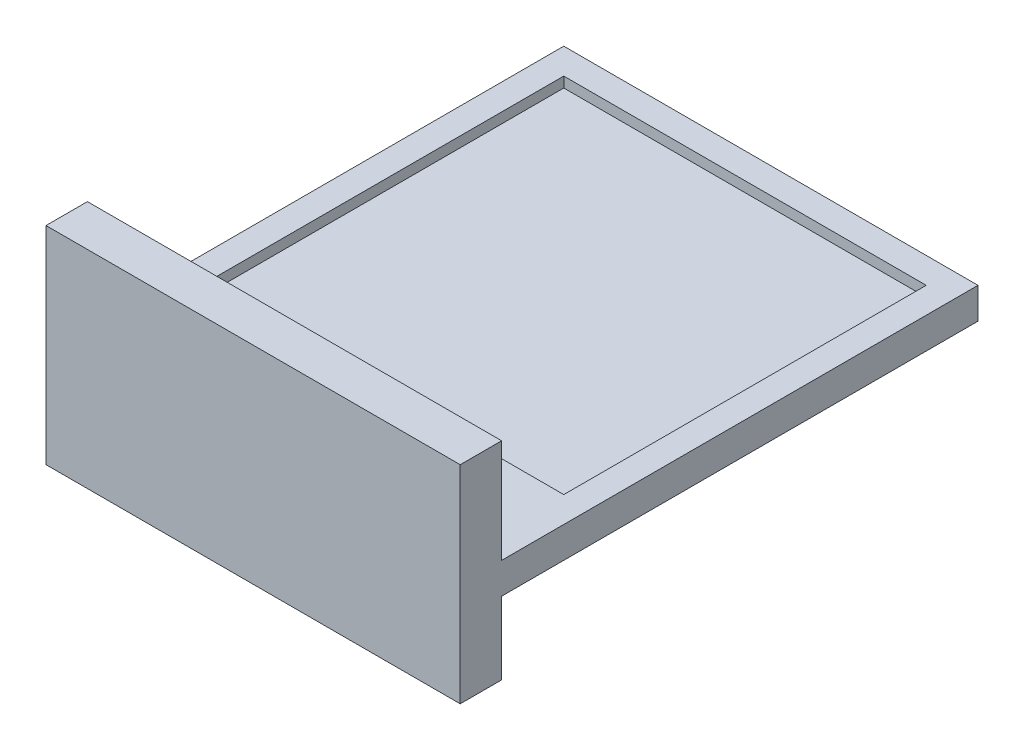
ISO-10303-21;
HEADER;
FILE_DESCRIPTION(('STEP AP214'),'2;1');
FILE_NAME('part.step','',(''),(''),'','','');
FILE_SCHEMA(('AUTOMOTIVE_DESIGN { 1 0 10303 214 1 1 1 1 }'));
ENDSEC;
DATA;
#1=APPLICATION_CONTEXT('core data for automotive mechanical design processes');
#2=APPLICATION_PROTOCOL_DEFINITION('international standard','automotive_design',2000,#1);
#3=PRODUCT_CONTEXT('',#1,'mechanical');
#4=PRODUCT('Part','Part','',(#3));
#5=PRODUCT_RELATED_PRODUCT_CATEGORY('part','',(#4));
#6=PRODUCT_DEFINITION_FORMATION('','',#4);
#7=PRODUCT_DEFINITION_CONTEXT('part definition',#1,'design');
#8=PRODUCT_DEFINITION('design','',#6,#7);
#9=PRODUCT_DEFINITION_SHAPE('','',#8);
#10=(LENGTH_UNIT() NAMED_UNIT(*) SI_UNIT(.MILLI.,.METRE.));
#11=(NAMED_UNIT(*) PLANE_ANGLE_UNIT() SI_UNIT($,.RADIAN.));
#12=(NAMED_UNIT(*) SI_UNIT($,.STERADIAN.) SOLID_ANGLE_UNIT());
#13=UNCERTAINTY_MEASURE_WITH_UNIT(LENGTH_MEASURE(1.E-05),#10,'distance_accuracy_value','');
#14=(GEOMETRIC_REPRESENTATION_CONTEXT(3) GLOBAL_UNCERTAINTY_ASSIGNED_CONTEXT((#13)) GLOBAL_UNIT_ASSIGNED_CONTEXT((#10,
#11,#12)) REPRESENTATION_CONTEXT('',''));
#15=CARTESIAN_POINT('',(0.,0.,0.));
#16=DIRECTION('',(0.,0.,1.));
#17=DIRECTION('',(1.,0.,0.));
#18=AXIS2_PLACEMENT_3D('',#15,#16,#17);
#19=CARTESIAN_POINT('',(-3.5,0.2,-4.5));
#20=DIRECTION('',(-1.,0.,0.));
#21=DIRECTION('',(0.,0.,1.));
#22=AXIS2_PLACEMENT_3D('',#19,#20,#21);
#23=PLANE('',#22);
#24=DIRECTION('',(0.,0.,1.));
#25=VECTOR('',#24,1.);
#26=CARTESIAN_POINT('',(-3.5,0.4,-4.5));
#27=LINE('',#26,#25);
#28=CARTESIAN_POINT('',(-3.5,0.4,-4.5));
#29=VERTEX_POINT('',#28);
#30=CARTESIAN_POINT('',(-3.5,0.4,2.5));
#31=VERTEX_POINT('',#30);
#32=EDGE_CURVE('E224',#29,#31,#27,.T.);
#33=ORIENTED_EDGE('',*,*,#32,.F.);
#34=DIRECTION('',(0.,1.,0.));
#35=VECTOR('',#34,1.);
#36=CARTESIAN_POINT('',(-3.5,0.2,-4.5));
#37=LINE('',#36,#35);
#38=CARTESIAN_POINT('',(-3.5,0.6,-4.5));
#39=VERTEX_POINT('',#38);
#40=EDGE_CURVE('E239',#29,#39,#37,.T.);
#41=ORIENTED_EDGE('',*,*,#40,.T.);
#42=DIRECTION('',(0.,0.,1.));
#43=VECTOR('',#42,1.);
#44=CARTESIAN_POINT('',(-3.5,0.6,-4.5));
#45=LINE('',#44,#43);
#46=CARTESIAN_POINT('',(-3.5,0.6,2.5));
#47=VERTEX_POINT('',#46);
#48=EDGE_CURVE('E226',#39,#47,#45,.T.);
#49=ORIENTED_EDGE('',*,*,#48,.T.);
#50=DIRECTION('',(0.,1.,0.));
#51=VECTOR('',#50,1.);
#52=CARTESIAN_POINT('',(-3.5,0.2,2.5));
#53=LINE('',#52,#51);
#54=EDGE_CURVE('E238',#31,#47,#53,.T.);
#55=ORIENTED_EDGE('',*,*,#54,.F.);
#56=EDGE_LOOP('',(#33,#41,#49,#55));
#57=FACE_BOUND('',#56,.T.);
#58=ADVANCED_FACE('F33',(#57),#23,.F.);
#59=CARTESIAN_POINT('',(-3.5,0.2,-4.5));
#60=DIRECTION('',(0.,0.,-1.));
#61=DIRECTION('',(-1.,0.,0.));
#62=AXIS2_PLACEMENT_3D('',#59,#60,#61);
#63=PLANE('',#62);
#64=DIRECTION('',(-1.,0.,0.));
#65=VECTOR('',#64,1.);
#66=CARTESIAN_POINT('',(-3.5,0.4,-4.5));
#67=LINE('',#66,#65);
#68=CARTESIAN_POINT('',(3.5,0.4,-4.5));
#69=VERTEX_POINT('',#68);
#70=EDGE_CURVE('E222',#69,#29,#67,.T.);
#71=ORIENTED_EDGE('',*,*,#70,.F.);
#72=DIRECTION('',(0.,1.,0.));
#73=VECTOR('',#72,1.);
#74=CARTESIAN_POINT('',(3.5,0.2,-4.5));
#75=LINE('',#74,#73);
#76=CARTESIAN_POINT('',(3.5,0.6,-4.5));
#77=VERTEX_POINT('',#76);
#78=EDGE_CURVE('E242',#69,#77,#75,.T.);
#79=ORIENTED_EDGE('',*,*,#78,.T.);
#80=DIRECTION('',(-1.,0.,0.));
#81=VECTOR('',#80,1.);
#82=CARTESIAN_POINT('',(-3.5,0.6,-4.5));
#83=LINE('',#82,#81);
#84=EDGE_CURVE('E235',#77,#39,#83,.T.);
#85=ORIENTED_EDGE('',*,*,#84,.T.);
#86=ORIENTED_EDGE('',*,*,#40,.F.);
#87=EDGE_LOOP('',(#71,#79,#85,#86));
#88=FACE_BOUND('',#87,.T.);
#89=ADVANCED_FACE('F284',(#88),#63,.F.);
#90=CARTESIAN_POINT('',(3.5,0.2,-4.5));
#91=DIRECTION('',(1.,0.,0.));
#92=DIRECTION('',(0.,0.,-1.));
#93=AXIS2_PLACEMENT_3D('',#90,#91,#92);
#94=PLANE('',#93);
#95=DIRECTION('',(0.,0.,-1.));
#96=VECTOR('',#95,1.);
#97=CARTESIAN_POINT('',(3.5,0.4,-4.5));
#98=LINE('',#97,#96);
#99=CARTESIAN_POINT('',(3.5,0.4,2.5));
#100=VERTEX_POINT('',#99);
#101=EDGE_CURVE('E214',#100,#69,#98,.T.);
#102=ORIENTED_EDGE('',*,*,#101,.F.);
#103=DIRECTION('',(0.,1.,0.));
#104=VECTOR('',#103,1.);
#105=CARTESIAN_POINT('',(3.5,0.2,2.5));
#106=LINE('',#105,#104);
#107=CARTESIAN_POINT('',(3.5,0.6,2.5));
#108=VERTEX_POINT('',#107);
#109=EDGE_CURVE('E244',#100,#108,#106,.T.);
#110=ORIENTED_EDGE('',*,*,#109,.T.);
#111=DIRECTION('',(0.,0.,-1.));
#112=VECTOR('',#111,1.);
#113=CARTESIAN_POINT('',(3.5,0.6,-4.5));
#114=LINE('',#113,#112);
#115=EDGE_CURVE('E232',#108,#77,#114,.T.);
#116=ORIENTED_EDGE('',*,*,#115,.T.);
#117=ORIENTED_EDGE('',*,*,#78,.F.);
#118=EDGE_LOOP('',(#102,#110,#116,#117));
#119=FACE_BOUND('',#118,.T.);
#120=ADVANCED_FACE('F274',(#119),#94,.F.);
#121=CARTESIAN_POINT('',(-3.5,0.2,2.5));
#122=DIRECTION('',(0.,0.,1.));
#123=DIRECTION('',(1.,0.,0.));
#124=AXIS2_PLACEMENT_3D('',#121,#122,#123);
#125=PLANE('',#124);
#126=DIRECTION('',(1.,0.,0.));
#127=VECTOR('',#126,1.);
#128=CARTESIAN_POINT('',(-3.5,0.4,2.5));
#129=LINE('',#128,#127);
#130=EDGE_CURVE('E41',#31,#100,#129,.T.);
#131=ORIENTED_EDGE('',*,*,#130,.F.);
#132=ORIENTED_EDGE('',*,*,#54,.T.);
#133=DIRECTION('',(1.,0.,0.));
#134=VECTOR('',#133,1.);
#135=CARTESIAN_POINT('',(-3.5,0.6,2.5));
#136=LINE('',#135,#134);
#137=EDGE_CURVE('E229',#47,#108,#136,.T.);
#138=ORIENTED_EDGE('',*,*,#137,.T.);
#139=ORIENTED_EDGE('',*,*,#109,.F.);
#140=EDGE_LOOP('',(#131,#132,#138,#139));
#141=FACE_BOUND('',#140,.T.);
#142=ADVANCED_FACE('F275',(#141),#125,.F.);
#143=CARTESIAN_POINT('',(-4.,0.6,5.));
#144=DIRECTION('',(1.,0.,0.));
#145=DIRECTION('',(0.,0.,-1.));
#146=AXIS2_PLACEMENT_3D('',#143,#144,#145);
#147=PLANE('',#146);
#148=DIRECTION('',(0.,0.,1.));
#149=VECTOR('',#148,1.);
#150=CARTESIAN_POINT('',(-4.,0.,5.));
#151=LINE('',#150,#149);
#152=CARTESIAN_POINT('',(-4.,0.,-5.));
#153=VERTEX_POINT('',#152);
#154=CARTESIAN_POINT('',(-4.,0.,4.2));
#155=VERTEX_POINT('',#154);
#156=EDGE_CURVE('E241',#153,#155,#151,.T.);
#157=ORIENTED_EDGE('',*,*,#156,.T.);
#158=DIRECTION('',(0.,1.,0.));
#159=VECTOR('',#158,1.);
#160=CARTESIAN_POINT('',(-4.,-1.4,4.2));
#161=LINE('',#160,#159);
#162=CARTESIAN_POINT('',(-4.,-1.4,4.2));
#163=VERTEX_POINT('',#162);
#164=EDGE_CURVE('E183',#163,#155,#161,.T.);
#165=ORIENTED_EDGE('',*,*,#164,.F.);
#166=DIRECTION('',(0.,0.,1.));
#167=VECTOR('',#166,1.);
#168=CARTESIAN_POINT('',(-4.,-1.4,5.));
#169=LINE('',#168,#167);
#170=CARTESIAN_POINT('',(-4.,-1.4,5.));
#171=VERTEX_POINT('',#170);
#172=EDGE_CURVE('E151',#163,#171,#169,.T.);
#173=ORIENTED_EDGE('',*,*,#172,.T.);
#174=DIRECTION('',(0.,-1.,0.));
#175=VECTOR('',#174,1.);
#176=CARTESIAN_POINT('',(-4.,0.6,5.));
#177=LINE('',#176,#175);
#178=CARTESIAN_POINT('',(-4.,2.6,5.));
#179=VERTEX_POINT('',#178);
#180=EDGE_CURVE('E144',#179,#171,#177,.T.);
#181=ORIENTED_EDGE('',*,*,#180,.F.);
#182=DIRECTION('',(0.,0.,1.));
#183=VECTOR('',#182,1.);
#184=CARTESIAN_POINT('',(-4.,2.6,5.));
#185=LINE('',#184,#183);
#186=CARTESIAN_POINT('',(-4.,2.6,4.2));
#187=VERTEX_POINT('',#186);
#188=EDGE_CURVE('E149',#187,#179,#185,.T.);
#189=ORIENTED_EDGE('',*,*,#188,.F.);
#190=CARTESIAN_POINT('',(-4.,0.6,4.2));
#191=VERTEX_POINT('',#190);
#192=EDGE_CURVE('E185',#191,#187,#161,.T.);
#193=ORIENTED_EDGE('',*,*,#192,.F.);
#194=DIRECTION('',(0.,0.,1.));
#195=VECTOR('',#194,1.);
#196=CARTESIAN_POINT('',(-4.,0.6,5.));
#197=LINE('',#196,#195);
#198=CARTESIAN_POINT('',(-4.,0.6,-5.));
#199=VERTEX_POINT('',#198);
#200=EDGE_CURVE('E53',#199,#191,#197,.T.);
#201=ORIENTED_EDGE('',*,*,#200,.F.);
#202=DIRECTION('',(0.,-1.,0.));
#203=VECTOR('',#202,1.);
#204=CARTESIAN_POINT('',(-4.,0.6,-5.));
#205=LINE('',#204,#203);
#206=EDGE_CURVE('E253',#199,#153,#205,.T.);
#207=ORIENTED_EDGE('',*,*,#206,.T.);
#208=EDGE_LOOP('',(#157,#165,#173,#181,#189,#193,#201,#207));
#209=FACE_BOUND('',#208,.T.);
#210=ADVANCED_FACE('F35',(#209),#147,.F.);
#211=CARTESIAN_POINT('',(4.,0.6,5.));
#212=DIRECTION('',(0.,0.,-1.));
#213=DIRECTION('',(-1.,0.,0.));
#214=AXIS2_PLACEMENT_3D('',#211,#212,#213);
#215=PLANE('',#214);
#216=ORIENTED_EDGE('',*,*,#180,.T.);
#217=DIRECTION('',(1.,0.,0.));
#218=VECTOR('',#217,1.);
#219=CARTESIAN_POINT('',(-4.,-1.4,5.));
#220=LINE('',#219,#218);
#221=CARTESIAN_POINT('',(4.,-1.4,5.));
#222=VERTEX_POINT('',#221);
#223=EDGE_CURVE('E174',#171,#222,#220,.T.);
#224=ORIENTED_EDGE('',*,*,#223,.T.);
#225=DIRECTION('',(0.,-1.,0.));
#226=VECTOR('',#225,1.);
#227=CARTESIAN_POINT('',(4.,0.6,5.));
#228=LINE('',#227,#226);
#229=CARTESIAN_POINT('',(4.,2.6,5.));
#230=VERTEX_POINT('',#229);
#231=EDGE_CURVE('E155',#230,#222,#228,.T.);
#232=ORIENTED_EDGE('',*,*,#231,.F.);
#233=DIRECTION('',(1.,0.,0.));
#234=VECTOR('',#233,1.);
#235=CARTESIAN_POINT('',(-4.,2.6,5.));
#236=LINE('',#235,#234);
#237=EDGE_CURVE('E158',#179,#230,#236,.T.);
#238=ORIENTED_EDGE('',*,*,#237,.F.);
#239=EDGE_LOOP('',(#216,#224,#232,#238));
#240=FACE_BOUND('',#239,.T.);
#241=ADVANCED_FACE('F159',(#240),#215,.F.);
#242=CARTESIAN_POINT('',(4.,0.6,5.));
#243=DIRECTION('',(-1.,0.,0.));
#244=DIRECTION('',(0.,0.,1.));
#245=AXIS2_PLACEMENT_3D('',#242,#243,#244);
#246=PLANE('',#245);
#247=DIRECTION('',(0.,0.,-1.));
#248=VECTOR('',#247,1.);
#249=CARTESIAN_POINT('',(4.,0.6,5.));
#250=LINE('',#249,#248);
#251=CARTESIAN_POINT('',(4.,0.6,4.2));
#252=VERTEX_POINT('',#251);
#253=CARTESIAN_POINT('',(4.,0.6,-5.));
#254=VERTEX_POINT('',#253);
#255=EDGE_CURVE('E248',#252,#254,#250,.T.);
#256=ORIENTED_EDGE('',*,*,#255,.F.);
#257=DIRECTION('',(0.,1.,0.));
#258=VECTOR('',#257,1.);
#259=CARTESIAN_POINT('',(4.,-1.4,4.2));
#260=LINE('',#259,#258);
#261=CARTESIAN_POINT('',(4.,2.6,4.2));
#262=VERTEX_POINT('',#261);
#263=EDGE_CURVE('E182',#252,#262,#260,.T.);
#264=ORIENTED_EDGE('',*,*,#263,.T.);
#265=DIRECTION('',(0.,0.,-1.));
#266=VECTOR('',#265,1.);
#267=CARTESIAN_POINT('',(4.,2.6,5.));
#268=LINE('',#267,#266);
#269=EDGE_CURVE('E163',#230,#262,#268,.T.);
#270=ORIENTED_EDGE('',*,*,#269,.F.);
#271=ORIENTED_EDGE('',*,*,#231,.T.);
#272=DIRECTION('',(0.,0.,-1.));
#273=VECTOR('',#272,1.);
#274=CARTESIAN_POINT('',(4.,-1.4,5.));
#275=LINE('',#274,#273);
#276=CARTESIAN_POINT('',(4.,-1.4,4.2));
#277=VERTEX_POINT('',#276);
#278=EDGE_CURVE('E176',#222,#277,#275,.T.);
#279=ORIENTED_EDGE('',*,*,#278,.T.);
#280=CARTESIAN_POINT('',(4.,0.,4.2));
#281=VERTEX_POINT('',#280);
#282=EDGE_CURVE('E186',#277,#281,#260,.T.);
#283=ORIENTED_EDGE('',*,*,#282,.T.);
#284=DIRECTION('',(0.,0.,-1.));
#285=VECTOR('',#284,1.);
#286=CARTESIAN_POINT('',(4.,0.,5.));
#287=LINE('',#286,#285);
#288=CARTESIAN_POINT('',(4.,0.,-5.));
#289=VERTEX_POINT('',#288);
#290=EDGE_CURVE('E255',#281,#289,#287,.T.);
#291=ORIENTED_EDGE('',*,*,#290,.T.);
#292=DIRECTION('',(0.,-1.,0.));
#293=VECTOR('',#292,1.);
#294=CARTESIAN_POINT('',(4.,0.6,-5.));
#295=LINE('',#294,#293);
#296=EDGE_CURVE('E260',#254,#289,#295,.T.);
#297=ORIENTED_EDGE('',*,*,#296,.F.);
#298=EDGE_LOOP('',(#256,#264,#270,#271,#279,#283,#291,#297));
#299=FACE_BOUND('',#298,.T.);
#300=ADVANCED_FACE('F304',(#299),#246,.F.);
#301=CARTESIAN_POINT('',(4.,0.6,-5.));
#302=DIRECTION('',(0.,0.,1.));
#303=DIRECTION('',(1.,0.,0.));
#304=AXIS2_PLACEMENT_3D('',#301,#302,#303);
#305=PLANE('',#304);
#306=DIRECTION('',(-1.,0.,0.));
#307=VECTOR('',#306,1.);
#308=CARTESIAN_POINT('',(3.7,0.2,-5.));
#309=LINE('',#308,#307);
#310=CARTESIAN_POINT('',(3.7,0.2,-5.));
#311=VERTEX_POINT('',#310);
#312=CARTESIAN_POINT('',(-3.7,0.2,-5.));
#313=VERTEX_POINT('',#312);
#314=EDGE_CURVE('E204',#311,#313,#309,.T.);
#315=ORIENTED_EDGE('',*,*,#314,.F.);
#316=DIRECTION('',(0.,-1.,0.));
#317=VECTOR('',#316,1.);
#318=CARTESIAN_POINT('',(3.7,0.4,-5.));
#319=LINE('',#318,#317);
#320=CARTESIAN_POINT('',(3.7,0.4,-5.));
#321=VERTEX_POINT('',#320);
#322=EDGE_CURVE('E190',#321,#311,#319,.T.);
#323=ORIENTED_EDGE('',*,*,#322,.F.);
#324=DIRECTION('',(-1.,0.,0.));
#325=VECTOR('',#324,1.);
#326=CARTESIAN_POINT('',(3.7,0.4,-5.));
#327=LINE('',#326,#325);
#328=CARTESIAN_POINT('',(-3.7,0.4,-5.));
#329=VERTEX_POINT('',#328);
#330=EDGE_CURVE('E195',#321,#329,#327,.T.);
#331=ORIENTED_EDGE('',*,*,#330,.T.);
#332=DIRECTION('',(0.,-1.,0.));
#333=VECTOR('',#332,1.);
#334=CARTESIAN_POINT('',(-3.7,0.4,-5.));
#335=LINE('',#334,#333);
#336=EDGE_CURVE('E207',#329,#313,#335,.T.);
#337=ORIENTED_EDGE('',*,*,#336,.T.);
#338=EDGE_LOOP('',(#315,#323,#331,#337));
#339=FACE_BOUND('',#338,.T.);
#340=DIRECTION('',(-1.,0.,0.));
#341=VECTOR('',#340,1.);
#342=CARTESIAN_POINT('',(4.,0.,-5.));
#343=LINE('',#342,#341);
#344=EDGE_CURVE('E249',#289,#153,#343,.T.);
#345=ORIENTED_EDGE('',*,*,#344,.T.);
#346=ORIENTED_EDGE('',*,*,#206,.F.);
#347=DIRECTION('',(-1.,0.,0.));
#348=VECTOR('',#347,1.);
#349=CARTESIAN_POINT('',(4.,0.6,-5.));
#350=LINE('',#349,#348);
#351=EDGE_CURVE('E251',#254,#199,#350,.T.);
#352=ORIENTED_EDGE('',*,*,#351,.F.);
#353=ORIENTED_EDGE('',*,*,#296,.T.);
#354=EDGE_LOOP('',(#345,#346,#352,#353));
#355=FACE_BOUND('',#354,.T.);
#356=ADVANCED_FACE('F298',(#339,#355),#305,.F.);
#357=CARTESIAN_POINT('',(0.,0.6,0.));
#358=DIRECTION('',(0.,1.,0.));
#359=DIRECTION('',(0.,0.,1.));
#360=AXIS2_PLACEMENT_3D('',#357,#358,#359);
#361=PLANE('',#360);
#362=DIRECTION('',(-1.,0.,0.));
#363=VECTOR('',#362,1.);
#364=CARTESIAN_POINT('',(0.,0.6,4.2));
#365=LINE('',#364,#363);
#366=EDGE_CURVE('E48',#252,#191,#365,.T.);
#367=ORIENTED_EDGE('',*,*,#366,.F.);
#368=ORIENTED_EDGE('',*,*,#255,.T.);
#369=ORIENTED_EDGE('',*,*,#351,.T.);
#370=ORIENTED_EDGE('',*,*,#200,.T.);
#371=EDGE_LOOP('',(#367,#368,#369,#370));
#372=FACE_BOUND('',#371,.T.);
#373=ORIENTED_EDGE('',*,*,#48,.F.);
#374=ORIENTED_EDGE('',*,*,#84,.F.);
#375=ORIENTED_EDGE('',*,*,#115,.F.);
#376=ORIENTED_EDGE('',*,*,#137,.F.);
#377=EDGE_LOOP('',(#373,#374,#375,#376));
#378=FACE_BOUND('',#377,.T.);
#379=ADVANCED_FACE('F281',(#372,#378),#361,.T.);
#380=CARTESIAN_POINT('',(0.,0.,0.));
#381=DIRECTION('',(0.,1.,0.));
#382=DIRECTION('',(0.,0.,1.));
#383=AXIS2_PLACEMENT_3D('',#380,#381,#382);
#384=PLANE('',#383);
#385=ORIENTED_EDGE('',*,*,#290,.F.);
#386=DIRECTION('',(-1.,0.,0.));
#387=VECTOR('',#386,1.);
#388=CARTESIAN_POINT('',(0.,0.,4.2));
#389=LINE('',#388,#387);
#390=EDGE_CURVE('E11',#281,#155,#389,.T.);
#391=ORIENTED_EDGE('',*,*,#390,.T.);
#392=ORIENTED_EDGE('',*,*,#156,.F.);
#393=ORIENTED_EDGE('',*,*,#344,.F.);
#394=EDGE_LOOP('',(#385,#391,#392,#393));
#395=FACE_BOUND('',#394,.T.);
#396=ADVANCED_FACE('F297',(#395),#384,.F.);
#397=CARTESIAN_POINT('',(3.7,0.4,3.));
#398=DIRECTION('',(0.,-1.,0.));
#399=DIRECTION('',(0.,0.,-1.));
#400=AXIS2_PLACEMENT_3D('',#397,#398,#399);
#401=PLANE('',#400);
#402=ORIENTED_EDGE('',*,*,#330,.F.);
#403=DIRECTION('',(0.,0.,-1.));
#404=VECTOR('',#403,1.);
#405=CARTESIAN_POINT('',(3.7,0.4,3.));
#406=LINE('',#405,#404);
#407=CARTESIAN_POINT('',(3.7,0.4,3.));
#408=VERTEX_POINT('',#407);
#409=EDGE_CURVE('E212',#408,#321,#406,.T.);
#410=ORIENTED_EDGE('',*,*,#409,.F.);
#411=DIRECTION('',(-1.,0.,0.));
#412=VECTOR('',#411,1.);
#413=CARTESIAN_POINT('',(3.7,0.4,3.));
#414=LINE('',#413,#412);
#415=CARTESIAN_POINT('',(-3.7,0.4,3.));
#416=VERTEX_POINT('',#415);
#417=EDGE_CURVE('E200',#408,#416,#414,.T.);
#418=ORIENTED_EDGE('',*,*,#417,.T.);
#419=DIRECTION('',(0.,0.,-1.));
#420=VECTOR('',#419,1.);
#421=CARTESIAN_POINT('',(-3.7,0.4,3.));
#422=LINE('',#421,#420);
#423=EDGE_CURVE('E215',#416,#329,#422,.T.);
#424=ORIENTED_EDGE('',*,*,#423,.T.);
#425=EDGE_LOOP('',(#402,#410,#418,#424));
#426=FACE_BOUND('',#425,.T.);
#427=ORIENTED_EDGE('',*,*,#32,.T.);
#428=ORIENTED_EDGE('',*,*,#130,.T.);
#429=ORIENTED_EDGE('',*,*,#101,.T.);
#430=ORIENTED_EDGE('',*,*,#70,.T.);
#431=EDGE_LOOP('',(#427,#428,#429,#430));
#432=FACE_BOUND('',#431,.T.);
#433=ADVANCED_FACE('F266',(#426,#432),#401,.T.);
#434=CARTESIAN_POINT('',(3.7,0.4,3.));
#435=DIRECTION('',(1.,0.,0.));
#436=DIRECTION('',(0.,0.,-1.));
#437=AXIS2_PLACEMENT_3D('',#434,#435,#436);
#438=PLANE('',#437);
#439=ORIENTED_EDGE('',*,*,#322,.T.);
#440=DIRECTION('',(0.,0.,-1.));
#441=VECTOR('',#440,1.);
#442=CARTESIAN_POINT('',(3.7,0.2,3.));
#443=LINE('',#442,#441);
#444=CARTESIAN_POINT('',(3.7,0.2,3.));
#445=VERTEX_POINT('',#444);
#446=EDGE_CURVE('E202',#445,#311,#443,.T.);
#447=ORIENTED_EDGE('',*,*,#446,.F.);
#448=DIRECTION('',(0.,-1.,0.));
#449=VECTOR('',#448,1.);
#450=CARTESIAN_POINT('',(3.7,0.4,3.));
#451=LINE('',#450,#449);
#452=EDGE_CURVE('E191',#408,#445,#451,.T.);
#453=ORIENTED_EDGE('',*,*,#452,.F.);
#454=ORIENTED_EDGE('',*,*,#409,.T.);
#455=EDGE_LOOP('',(#439,#447,#453,#454));
#456=FACE_BOUND('',#455,.T.);
#457=ADVANCED_FACE('F327',(#456),#438,.F.);
#458=CARTESIAN_POINT('',(-3.7,0.4,3.));
#459=DIRECTION('',(1.,0.,0.));
#460=DIRECTION('',(0.,1.,0.));
#461=AXIS2_PLACEMENT_3D('',#458,#459,#460);
#462=PLANE('',#461);
#463=ORIENTED_EDGE('',*,*,#336,.F.);
#464=ORIENTED_EDGE('',*,*,#423,.F.);
#465=DIRECTION('',(0.,-1.,0.));
#466=VECTOR('',#465,1.);
#467=CARTESIAN_POINT('',(-3.7,0.4,3.));
#468=LINE('',#467,#466);
#469=CARTESIAN_POINT('',(-3.7,0.2,3.));
#470=VERTEX_POINT('',#469);
#471=EDGE_CURVE('E198',#416,#470,#468,.T.);
#472=ORIENTED_EDGE('',*,*,#471,.T.);
#473=DIRECTION('',(0.,0.,-1.));
#474=VECTOR('',#473,1.);
#475=CARTESIAN_POINT('',(-3.7,0.2,3.));
#476=LINE('',#475,#474);
#477=EDGE_CURVE('E217',#470,#313,#476,.T.);
#478=ORIENTED_EDGE('',*,*,#477,.T.);
#479=EDGE_LOOP('',(#463,#464,#472,#478));
#480=FACE_BOUND('',#479,.T.);
#481=ADVANCED_FACE('F330',(#480),#462,.T.);
#482=CARTESIAN_POINT('',(0.,0.,3.));
#483=DIRECTION('',(0.,0.,-1.));
#484=DIRECTION('',(-1.,0.,0.));
#485=AXIS2_PLACEMENT_3D('',#482,#483,#484);
#486=PLANE('',#485);
#487=ORIENTED_EDGE('',*,*,#452,.T.);
#488=DIRECTION('',(-1.,0.,0.));
#489=VECTOR('',#488,1.);
#490=CARTESIAN_POINT('',(3.7,0.2,3.));
#491=LINE('',#490,#489);
#492=EDGE_CURVE('E194',#445,#470,#491,.T.);
#493=ORIENTED_EDGE('',*,*,#492,.T.);
#494=ORIENTED_EDGE('',*,*,#471,.F.);
#495=ORIENTED_EDGE('',*,*,#417,.F.);
#496=EDGE_LOOP('',(#487,#493,#494,#495));
#497=FACE_BOUND('',#496,.T.);
#498=ADVANCED_FACE('F325',(#497),#486,.T.);
#499=CARTESIAN_POINT('',(0.,0.2,0.));
#500=DIRECTION('',(0.,1.,0.));
#501=DIRECTION('',(0.,0.,1.));
#502=AXIS2_PLACEMENT_3D('',#499,#500,#501);
#503=PLANE('',#502);
#504=ORIENTED_EDGE('',*,*,#314,.T.);
#505=ORIENTED_EDGE('',*,*,#477,.F.);
#506=ORIENTED_EDGE('',*,*,#492,.F.);
#507=ORIENTED_EDGE('',*,*,#446,.T.);
#508=EDGE_LOOP('',(#504,#505,#506,#507));
#509=FACE_BOUND('',#508,.T.);
#510=ADVANCED_FACE('F321',(#509),#503,.T.);
#511=CARTESIAN_POINT('',(0.,-1.4,0.));
#512=DIRECTION('',(0.,-1.,0.));
#513=DIRECTION('',(0.,0.,-1.));
#514=AXIS2_PLACEMENT_3D('',#511,#512,#513);
#515=PLANE('',#514);
#516=ORIENTED_EDGE('',*,*,#172,.F.);
#517=DIRECTION('',(-1.,0.,0.));
#518=VECTOR('',#517,1.);
#519=CARTESIAN_POINT('',(-4.,-1.4,4.2));
#520=LINE('',#519,#518);
#521=EDGE_CURVE('E179',#277,#163,#520,.T.);
#522=ORIENTED_EDGE('',*,*,#521,.F.);
#523=ORIENTED_EDGE('',*,*,#278,.F.);
#524=ORIENTED_EDGE('',*,*,#223,.F.);
#525=EDGE_LOOP('',(#516,#522,#523,#524));
#526=FACE_BOUND('',#525,.T.);
#527=ADVANCED_FACE('F324',(#526),#515,.T.);
#528=CARTESIAN_POINT('',(-4.,-1.4,4.2));
#529=DIRECTION('',(0.,0.,-1.));
#530=DIRECTION('',(-1.,0.,0.));
#531=AXIS2_PLACEMENT_3D('',#528,#529,#530);
#532=PLANE('',#531);
#533=ORIENTED_EDGE('',*,*,#390,.F.);
#534=ORIENTED_EDGE('',*,*,#282,.F.);
#535=ORIENTED_EDGE('',*,*,#521,.T.);
#536=ORIENTED_EDGE('',*,*,#164,.T.);
#537=EDGE_LOOP('',(#533,#534,#535,#536));
#538=FACE_BOUND('',#537,.T.);
#539=ADVANCED_FACE('F344',(#538),#532,.T.);
#540=ORIENTED_EDGE('',*,*,#263,.F.);
#541=ORIENTED_EDGE('',*,*,#366,.T.);
#542=ORIENTED_EDGE('',*,*,#192,.T.);
#543=DIRECTION('',(-1.,0.,0.));
#544=VECTOR('',#543,1.);
#545=CARTESIAN_POINT('',(-4.,2.6,4.2));
#546=LINE('',#545,#544);
#547=EDGE_CURVE('E168',#262,#187,#546,.T.);
#548=ORIENTED_EDGE('',*,*,#547,.F.);
#549=EDGE_LOOP('',(#540,#541,#542,#548));
#550=FACE_BOUND('',#549,.T.);
#551=ADVANCED_FACE('F341',(#550),#532,.T.);
#552=CARTESIAN_POINT('',(0.,2.6,0.));
#553=DIRECTION('',(0.,-1.,0.));
#554=DIRECTION('',(0.,0.,-1.));
#555=AXIS2_PLACEMENT_3D('',#552,#553,#554);
#556=PLANE('',#555);
#557=ORIENTED_EDGE('',*,*,#188,.T.);
#558=ORIENTED_EDGE('',*,*,#237,.T.);
#559=ORIENTED_EDGE('',*,*,#269,.T.);
#560=ORIENTED_EDGE('',*,*,#547,.T.);
#561=EDGE_LOOP('',(#557,#558,#559,#560));
#562=FACE_BOUND('',#561,.T.);
#563=ADVANCED_FACE('F166',(#562),#556,.F.);
#564=CLOSED_SHELL('',(#58,#89,#120,#142,#210,#241,#300,#356,#379,#396,#433,#457,#481,#498,#510,
#527,#539,#551,#563));
#565=MANIFOLD_SOLID_BREP('B2',#564);
#566=ADVANCED_BREP_SHAPE_REPRESENTATION('',(#18,#565),#14);
#567=SHAPE_DEFINITION_REPRESENTATION(#9,#566);
ENDSEC;
END-ISO-10303-21;
